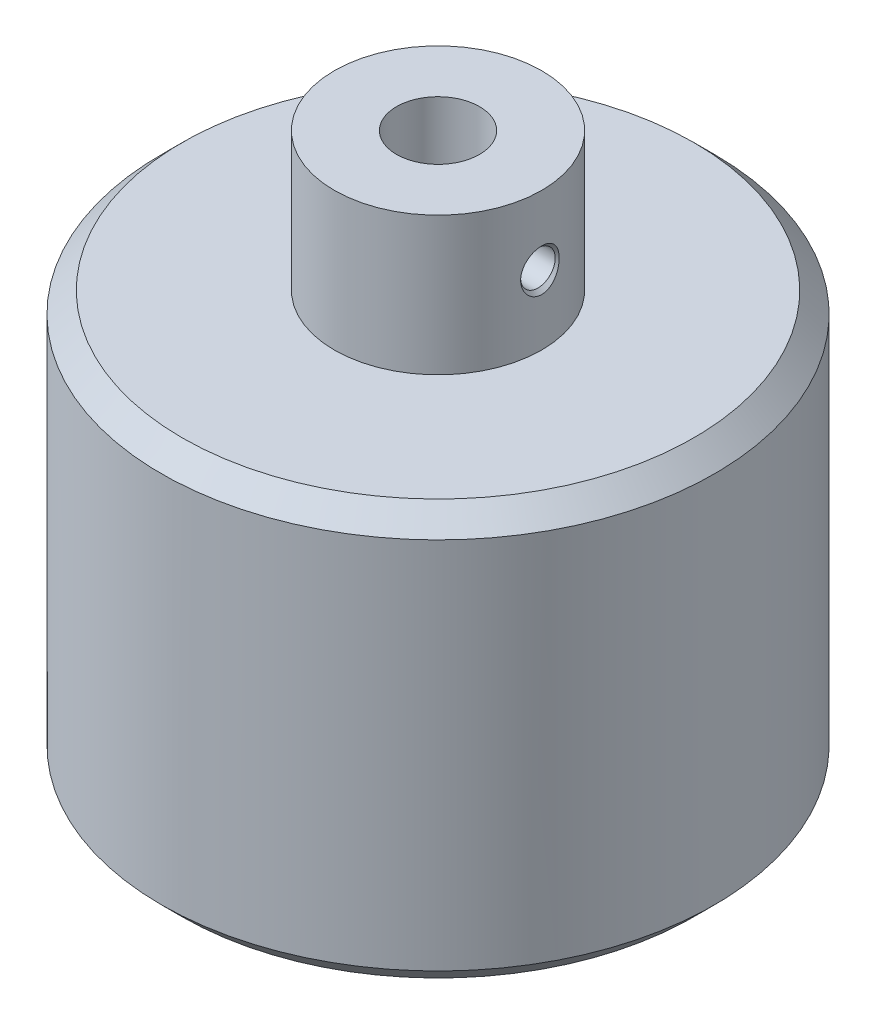
ISO-10303-21;
HEADER;
FILE_DESCRIPTION(('STEP AP214'),'2;1');
FILE_NAME('part.step','',(''),(''),'','','');
FILE_SCHEMA(('AUTOMOTIVE_DESIGN { 1 0 10303 214 1 1 1 1 }'));
ENDSEC;
DATA;
#1=APPLICATION_CONTEXT('core data for automotive mechanical design processes');
#2=APPLICATION_PROTOCOL_DEFINITION('international standard','automotive_design',2000,#1);
#3=PRODUCT_CONTEXT('',#1,'mechanical');
#4=PRODUCT('Part','Part','',(#3));
#5=PRODUCT_RELATED_PRODUCT_CATEGORY('part','',(#4));
#6=PRODUCT_DEFINITION_FORMATION('','',#4);
#7=PRODUCT_DEFINITION_CONTEXT('part definition',#1,'design');
#8=PRODUCT_DEFINITION('design','',#6,#7);
#9=PRODUCT_DEFINITION_SHAPE('','',#8);
#10=(LENGTH_UNIT() NAMED_UNIT(*) SI_UNIT(.MILLI.,.METRE.));
#11=(NAMED_UNIT(*) PLANE_ANGLE_UNIT() SI_UNIT($,.RADIAN.));
#12=(NAMED_UNIT(*) SI_UNIT($,.STERADIAN.) SOLID_ANGLE_UNIT());
#13=UNCERTAINTY_MEASURE_WITH_UNIT(LENGTH_MEASURE(1.E-05),#10,'distance_accuracy_value','');
#14=(GEOMETRIC_REPRESENTATION_CONTEXT(3) GLOBAL_UNCERTAINTY_ASSIGNED_CONTEXT((#13)) GLOBAL_UNIT_ASSIGNED_CONTEXT((#10,
#11,#12)) REPRESENTATION_CONTEXT('',''));
#15=CARTESIAN_POINT('',(0.,0.,0.));
#16=DIRECTION('',(0.,0.,1.));
#17=DIRECTION('',(1.,0.,0.));
#18=AXIS2_PLACEMENT_3D('',#15,#16,#17);
#19=CARTESIAN_POINT('',(0.,30.,0.));
#20=DIRECTION('',(0.,-1.,0.));
#21=DIRECTION('',(0.,0.,-1.));
#22=AXIS2_PLACEMENT_3D('',#19,#20,#21);
#23=CYLINDRICAL_SURFACE('',#22,20.);
#24=CARTESIAN_POINT('',(0.,1.49999999999999,0.));
#25=DIRECTION('',(0.,1.,0.));
#26=DIRECTION('',(0.,0.,1.));
#27=AXIS2_PLACEMENT_3D('',#24,#25,#26);
#28=CIRCLE('',#27,20.);
#29=CARTESIAN_POINT('',(0.,1.49999999999999,20.));
#30=VERTEX_POINT('',#29);
#31=EDGE_CURVE('E43',#30,#30,#28,.T.);
#32=ORIENTED_EDGE('',*,*,#31,.T.);
#33=EDGE_LOOP('',(#32));
#34=FACE_BOUND('',#33,.T.);
#35=CARTESIAN_POINT('',(0.,28.5,0.));
#36=DIRECTION('',(0.,1.,0.));
#37=DIRECTION('',(0.,0.,1.));
#38=AXIS2_PLACEMENT_3D('',#35,#36,#37);
#39=CIRCLE('',#38,20.);
#40=CARTESIAN_POINT('',(0.,28.5,-20.));
#41=VERTEX_POINT('',#40);
#42=EDGE_CURVE('E47',#41,#41,#39,.F.);
#43=ORIENTED_EDGE('',*,*,#42,.T.);
#44=EDGE_LOOP('',(#43));
#45=FACE_BOUND('',#44,.T.);
#46=ADVANCED_FACE('F32',(#34,#45),#23,.T.);
#47=CARTESIAN_POINT('',(0.,30.,0.));
#48=DIRECTION('',(0.,1.,0.));
#49=DIRECTION('',(0.,0.,1.));
#50=AXIS2_PLACEMENT_3D('',#47,#48,#49);
#51=PLANE('',#50);
#52=CARTESIAN_POINT('',(0.,30.,0.));
#53=DIRECTION('',(0.,1.,0.));
#54=DIRECTION('',(0.,0.,1.));
#55=AXIS2_PLACEMENT_3D('',#52,#53,#54);
#56=CIRCLE('',#55,18.5);
#57=CARTESIAN_POINT('',(0.,30.,-18.5));
#58=VERTEX_POINT('',#57);
#59=EDGE_CURVE('E10',#58,#58,#56,.T.);
#60=ORIENTED_EDGE('',*,*,#59,.T.);
#61=EDGE_LOOP('',(#60));
#62=FACE_BOUND('',#61,.T.);
#63=CARTESIAN_POINT('',(0.,30.,0.));
#64=DIRECTION('',(0.,1.,0.));
#65=DIRECTION('',(0.,0.,1.));
#66=AXIS2_PLACEMENT_3D('',#63,#64,#65);
#67=CIRCLE('',#66,7.5);
#68=CARTESIAN_POINT('',(0.,30.,7.5));
#69=VERTEX_POINT('',#68);
#70=EDGE_CURVE('E59',#69,#69,#67,.F.);
#71=ORIENTED_EDGE('',*,*,#70,.T.);
#72=EDGE_LOOP('',(#71));
#73=FACE_BOUND('',#72,.T.);
#74=ADVANCED_FACE('F99',(#62,#73),#51,.T.);
#75=CARTESIAN_POINT('',(0.,0.,0.));
#76=DIRECTION('',(0.,1.,0.));
#77=DIRECTION('',(0.,0.,1.));
#78=AXIS2_PLACEMENT_3D('',#75,#76,#77);
#79=PLANE('',#78);
#80=CARTESIAN_POINT('',(0.,0.,0.));
#81=DIRECTION('',(0.,1.,0.));
#82=DIRECTION('',(0.,0.,1.));
#83=AXIS2_PLACEMENT_3D('',#80,#81,#82);
#84=CIRCLE('',#83,18.5);
#85=CARTESIAN_POINT('',(0.,0.,18.5));
#86=VERTEX_POINT('',#85);
#87=EDGE_CURVE('E39',#86,#86,#84,.F.);
#88=ORIENTED_EDGE('',*,*,#87,.T.);
#89=EDGE_LOOP('',(#88));
#90=FACE_BOUND('',#89,.T.);
#91=CARTESIAN_POINT('',(0.,0.,0.));
#92=DIRECTION('',(0.,1.,0.));
#93=DIRECTION('',(0.,0.,1.));
#94=AXIS2_PLACEMENT_3D('',#91,#92,#93);
#95=CIRCLE('',#94,3.);
#96=CARTESIAN_POINT('',(0.,0.,3.));
#97=VERTEX_POINT('',#96);
#98=EDGE_CURVE('E88',#97,#97,#95,.T.);
#99=ORIENTED_EDGE('',*,*,#98,.T.);
#100=EDGE_LOOP('',(#99));
#101=FACE_BOUND('',#100,.T.);
#102=ADVANCED_FACE('F104',(#90,#101),#79,.F.);
#103=CARTESIAN_POINT('',(0.,40.,0.));
#104=DIRECTION('',(0.,-1.,0.));
#105=DIRECTION('',(0.,0.,-1.));
#106=AXIS2_PLACEMENT_3D('',#103,#104,#105);
#107=CYLINDRICAL_SURFACE('',#106,7.5);
#108=CARTESIAN_POINT('',(7.43001548003896,33.9645290952906,-1.02218884462689));
#109=CARTESIAN_POINT('',(7.43639922008393,33.9097481715944,-0.975784360702175));
#110=CARTESIAN_POINT('',(7.44288567725482,33.8583353599831,-0.925421675809617));
#111=CARTESIAN_POINT('',(7.45551003217192,33.7635914759309,-0.8175084104551));
#112=CARTESIAN_POINT('',(7.46164784673965,33.7202623264885,-0.759956125102899));
#113=CARTESIAN_POINT('',(7.47372710362342,33.6381636485537,-0.630954394262095));
#114=CARTESIAN_POINT('',(7.47954428253293,33.6006749497841,-0.558668406622472));
#115=CARTESIAN_POINT('',(7.48925514164225,33.5395862251771,-0.408308231881432));
#116=CARTESIAN_POINT('',(7.49314938643558,33.5159821222877,-0.330235751506737));
#117=CARTESIAN_POINT('',(7.49824221982515,33.4853702900279,-0.177922897353143));
#118=CARTESIAN_POINT('',(7.49964659618561,33.4770927483593,-0.103943655998851));
#119=CARTESIAN_POINT('',(7.50023488295556,33.4736087383806,0.0443146590618781));
#120=CARTESIAN_POINT('',(7.49941966453717,33.4783971417995,0.118593603710441));
#121=CARTESIAN_POINT('',(7.49576445751884,33.5002299731908,0.261492180615364));
#122=CARTESIAN_POINT('',(7.49302640931871,33.5166577075203,0.33021017342384));
#123=CARTESIAN_POINT('',(7.48593295224222,33.5603612170139,0.464004184734205));
#124=CARTESIAN_POINT('',(7.48157737978603,33.5876380893686,0.529079834120613));
#125=CARTESIAN_POINT('',(7.47153687862633,33.6529558331763,0.655984695435617));
#126=CARTESIAN_POINT('',(7.46581550653599,33.6912992027681,0.717654694801995));
#127=CARTESIAN_POINT('',(7.45368553273536,33.7770120959233,0.834275955871314));
#128=CARTESIAN_POINT('',(7.44727671181421,33.8243845023923,0.88922506241738));
#129=CARTESIAN_POINT('',(7.43381213224409,33.9310434327827,0.995772079421973));
#130=CARTESIAN_POINT('',(7.42674722815583,33.9909962679959,1.04670145142327));
#131=CARTESIAN_POINT('',(7.41319414196055,34.1180724823424,1.13873675079608));
#132=CARTESIAN_POINT('',(7.40670618101186,34.1851985896669,1.17983892123625));
#133=CARTESIAN_POINT('',(7.39440209830874,34.3310024956612,1.25474623493326));
#134=CARTESIAN_POINT('',(7.38869374004265,34.4101771984203,1.28760378092002));
#135=CARTESIAN_POINT('',(7.37928759679343,34.5728215336854,1.34046152232599));
#136=CARTESIAN_POINT('',(7.37559034916398,34.6562923075546,1.36045828169948));
#137=CARTESIAN_POINT('',(7.37046355239542,34.8298578249214,1.38797681918808));
#138=CARTESIAN_POINT('',(7.36916356021645,34.9200700077415,1.39478683120812));
#139=CARTESIAN_POINT('',(7.36937366227069,35.1004066362285,1.39367520889355));
#140=CARTESIAN_POINT('',(7.37088415347988,35.1905310677016,1.38575149344512));
#141=CARTESIAN_POINT('',(7.3765851928294,35.3695480825654,1.35507829206451));
#142=CARTESIAN_POINT('',(7.38081583760976,35.4584015575074,1.33210689767788));
#143=CARTESIAN_POINT('',(7.39149151307905,35.6308565581466,1.27153200574317));
#144=CARTESIAN_POINT('',(7.39793671981201,35.7144576656878,1.23392734490905));
#145=CARTESIAN_POINT('',(7.41214841705282,35.8725867100132,1.14543787911347));
#146=CARTESIAN_POINT('',(7.41989409194696,35.9472299570333,1.0947564182379));
#147=CARTESIAN_POINT('',(7.43580697153918,36.0862283665429,0.980850943409379));
#148=CARTESIAN_POINT('',(7.44397406178901,36.1505863030718,0.917630321723148));
#149=CARTESIAN_POINT('',(7.4591809573134,36.2629512801142,0.784129806114616));
#150=CARTESIAN_POINT('',(7.46625867450482,36.3116903444969,0.714472302826206));
#151=CARTESIAN_POINT('',(7.47888585855502,36.3953811103906,0.567188702616259));
#152=CARTESIAN_POINT('',(7.48443656601968,36.4303440142677,0.489569145210668));
#153=CARTESIAN_POINT('',(7.49279457332355,36.4819724132014,0.336630906505777));
#154=CARTESIAN_POINT('',(7.49581423219888,36.5000732580089,0.261807789756014));
#155=CARTESIAN_POINT('',(7.49957505778735,36.5225242802148,0.110079367534782));
#156=CARTESIAN_POINT('',(7.50031742711152,36.5268817153877,0.0331751827069539));
#157=CARTESIAN_POINT('',(7.49946312322404,36.5218194753594,-0.114496578108778));
#158=CARTESIAN_POINT('',(7.49803372275698,36.5133851286439,-0.185301207844606));
#159=CARTESIAN_POINT('',(7.49330175238252,36.4849245284627,-0.324464103373541));
#160=CARTESIAN_POINT('',(7.4899992262175,36.4648985456918,-0.392822426254668));
#161=CARTESIAN_POINT('',(7.48186217326874,36.4140387679977,-0.52552735843261));
#162=CARTESIAN_POINT('',(7.47702266068911,36.3831697646024,-0.589860084620356));
#163=CARTESIAN_POINT('',(7.46630242718634,36.3118181316151,-0.712842998432213));
#164=CARTESIAN_POINT('',(7.46042144041114,36.2713330464701,-0.771491729201932));
#165=CARTESIAN_POINT('',(7.44772943136413,36.1788971148575,-0.885932073753493));
#166=CARTESIAN_POINT('',(7.44088203743954,36.1263371691847,-0.941226911300894));
#167=CARTESIAN_POINT('',(7.42728891193738,36.0133424957455,-1.04308471371259));
#168=CARTESIAN_POINT('',(7.42054322066765,35.9529047327805,-1.08964429606746));
#169=CARTESIAN_POINT('',(7.40718607879,35.8199216963037,-1.17717283127671));
#170=CARTESIAN_POINT('',(7.40064355188102,35.7467744610288,-1.21723874192614));
#171=CARTESIAN_POINT('',(7.38909339084178,35.5950246068513,-1.28549599594284));
#172=CARTESIAN_POINT('',(7.38408622489728,35.5164203328484,-1.31368371820988));
#173=CARTESIAN_POINT('',(7.37584528575633,35.3503669394214,-1.35922200044936));
#174=CARTESIAN_POINT('',(7.37275194059692,35.2626774810087,-1.37572511639109));
#175=CARTESIAN_POINT('',(7.36923537742758,35.08572353141,-1.39443912424063));
#176=CARTESIAN_POINT('',(7.36881281380088,34.9964586595953,-1.3966465134752));
#177=CARTESIAN_POINT('',(7.37071163034799,34.8163703546904,-1.38659247563587));
#178=CARTESIAN_POINT('',(7.37310674923995,34.7255691463853,-1.37394223917393));
#179=CARTESIAN_POINT('',(7.38048297879077,34.5474334549448,-1.33374868606027));
#180=CARTESIAN_POINT('',(7.38546357822963,34.4600982901515,-1.30620831354976));
#181=CARTESIAN_POINT('',(7.39671630188251,34.3012836110106,-1.24078544789289));
#182=CARTESIAN_POINT('',(7.40277196694046,34.2291393468262,-1.20447064840481));
#183=CARTESIAN_POINT('',(7.41584777174045,34.0914351061866,-1.12114949413117));
#184=CARTESIAN_POINT('',(7.42286722942637,34.025870529718,-1.07415068491252));
#185=CARTESIAN_POINT('',(7.43001548003896,33.9645290952906,-1.02218884462689));
#186=B_SPLINE_CURVE_WITH_KNOTS('',3,(#108,#109,#110,#111,#112,#113,#114,#115,#116,#117,#118,
#119,#120,#121,#122,#123,#124,#125,#126,#127,#128,#129,#130,#131,#132,#133,#134,#135,#136,#137,
#138,#139,#140,#141,#142,#143,#144,#145,#146,#147,#148,#149,#150,#151,#152,#153,#154,#155,#156,
#157,#158,#159,#160,#161,#162,#163,#164,#165,#166,#167,#168,#169,#170,#171,#172,#173,#174,#175,
#176,#177,#178,#179,#180,#181,#182,#183,#184,#185),.UNSPECIFIED.,.T.,.F.,(4,2,2,2,2,2,2,2,2,2,2,
2,2,2,2,2,2,2,2,2,2,2,2,2,2,2,2,2,2,2,2,2,2,2,2,2,2,2,4),(0.,0.216019342441091,0.4320900077435,
0.675641911290071,0.919122262875252,1.14133033231608,1.36345119954822,1.5746069634577,
1.78578408731507,2.0033921473424,2.22106980478516,2.45702056842509,2.69306139213585,
2.94966477214477,3.20633668101575,3.47651403663212,3.74672955723728,4.02102247947896,
4.29533721136495,4.56561951714876,4.83582880192688,5.09036071687425,5.34468522472085,
5.57457225508551,5.80433786377281,6.01728126905524,6.23021970175818,6.44385605985824,
6.65754703068501,6.88637703362007,7.11529546319704,7.365187353059,7.61515536817453,
7.88178257020165,8.14847509752937,8.422305105934,8.69608099129128,8.93814102875581,
9.18003063987057),.UNSPECIFIED.);
#187=CARTESIAN_POINT('',(7.43001548003896,33.9645290952906,-1.02218884462689));
#188=VERTEX_POINT('',#187);
#189=EDGE_CURVE('E52',#188,#188,#186,.T.);
#190=ORIENTED_EDGE('',*,*,#189,.T.);
#191=EDGE_LOOP('',(#190));
#192=FACE_BOUND('',#191,.T.);
#193=ORIENTED_EDGE('',*,*,#70,.F.);
#194=EDGE_LOOP('',(#193));
#195=FACE_BOUND('',#194,.T.);
#196=CARTESIAN_POINT('',(0.,40.,0.));
#197=DIRECTION('',(0.,1.,0.));
#198=DIRECTION('',(0.,0.,1.));
#199=AXIS2_PLACEMENT_3D('',#196,#197,#198);
#200=CIRCLE('',#199,7.5);
#201=CARTESIAN_POINT('',(0.,40.,7.5));
#202=VERTEX_POINT('',#201);
#203=EDGE_CURVE('E91',#202,#202,#200,.T.);
#204=ORIENTED_EDGE('',*,*,#203,.F.);
#205=EDGE_LOOP('',(#204));
#206=FACE_BOUND('',#205,.T.);
#207=ADVANCED_FACE('F61',(#192,#195,#206),#107,.T.);
#208=CARTESIAN_POINT('',(0.,40.,0.));
#209=DIRECTION('',(0.,1.,0.));
#210=DIRECTION('',(0.,0.,1.));
#211=AXIS2_PLACEMENT_3D('',#208,#209,#210);
#212=PLANE('',#211);
#213=CARTESIAN_POINT('',(0.,40.,0.));
#214=DIRECTION('',(0.,1.,0.));
#215=DIRECTION('',(0.,0.,1.));
#216=AXIS2_PLACEMENT_3D('',#213,#214,#215);
#217=CIRCLE('',#216,3.);
#218=CARTESIAN_POINT('',(0.,40.,3.));
#219=VERTEX_POINT('',#218);
#220=EDGE_CURVE('E86',#219,#219,#217,.T.);
#221=ORIENTED_EDGE('',*,*,#220,.F.);
#222=EDGE_LOOP('',(#221));
#223=FACE_BOUND('',#222,.T.);
#224=ORIENTED_EDGE('',*,*,#203,.T.);
#225=EDGE_LOOP('',(#224));
#226=FACE_BOUND('',#225,.T.);
#227=ADVANCED_FACE('F103',(#223,#226),#212,.T.);
#228=CARTESIAN_POINT('',(0.,0.,0.));
#229=DIRECTION('',(0.,1.,0.));
#230=DIRECTION('',(0.,0.,1.));
#231=AXIS2_PLACEMENT_3D('',#228,#229,#230);
#232=CYLINDRICAL_SURFACE('',#231,3.);
#233=CARTESIAN_POINT('',(2.72717802865893,35.,-1.25));
#234=CARTESIAN_POINT('',(2.72718519563219,35.0666718908969,-1.24999259066568));
#235=CARTESIAN_POINT('',(2.729658595344,35.1334526568262,-1.24463203881503));
#236=CARTESIAN_POINT('',(2.73923833650884,35.2650869420571,-1.22339678947785));
#237=CARTESIAN_POINT('',(2.74635725824267,35.3299347266752,-1.20749354003277));
#238=CARTESIAN_POINT('',(2.76426917574768,35.4555611296911,-1.16589988419451));
#239=CARTESIAN_POINT('',(2.77504717562616,35.516355163715,-1.14024937431428));
#240=CARTESIAN_POINT('',(2.79904148565793,35.6327594495781,-1.08000637754463));
#241=CARTESIAN_POINT('',(2.81225721880783,35.6883709234331,-1.04541600591531));
#242=CARTESIAN_POINT('',(2.84055762619857,35.7963257249735,-0.965973882676168));
#243=CARTESIAN_POINT('',(2.85570568079146,35.8483075587441,-0.92065323818441));
#244=CARTESIAN_POINT('',(2.88564295372227,35.9442002224976,-0.822021675745551));
#245=CARTESIAN_POINT('',(2.90043203180789,35.988107940613,-0.768707691374007));
#246=CARTESIAN_POINT('',(2.92875537930613,36.0684495308793,-0.652763393797352));
#247=CARTESIAN_POINT('',(2.94220739975291,36.1044766280324,-0.589829293683664));
#248=CARTESIAN_POINT('',(2.96556519993426,36.1652760205056,-0.458132022362359));
#249=CARTESIAN_POINT('',(2.97547255347157,36.1900533119642,-0.38937145487213));
#250=CARTESIAN_POINT('',(2.99017521042367,36.2263394587567,-0.251768498025171));
#251=CARTESIAN_POINT('',(2.99520971127466,36.238471694902,-0.183116576196086));
#252=CARTESIAN_POINT('',(3.00046828611204,36.2511376411599,-0.04457918036501));
#253=CARTESIAN_POINT('',(3.00069431131015,36.251676055883,0.0253057817645132));
#254=CARTESIAN_POINT('',(2.99645129133057,36.2414657190667,0.159792780112566));
#255=CARTESIAN_POINT('',(2.99226714648664,36.2314018994743,0.224457488607312));
#256=CARTESIAN_POINT('',(2.98006516750309,36.2014468973618,0.351082893931455));
#257=CARTESIAN_POINT('',(2.97204705074577,36.1815549903698,0.413043391054915));
#258=CARTESIAN_POINT('',(2.95279852414029,36.1322719591054,0.533638118077524));
#259=CARTESIAN_POINT('',(2.94152097126085,36.1027405371292,0.592207177074904));
#260=CARTESIAN_POINT('',(2.91685713989805,36.0351542432997,0.703711767281961));
#261=CARTESIAN_POINT('',(2.90347011666255,35.997096359155,0.756645297756972));
#262=CARTESIAN_POINT('',(2.87481698777061,35.9104175795954,0.859340911707922));
#263=CARTESIAN_POINT('',(2.8594849435601,35.861241208721,0.908616437316238));
#264=CARTESIAN_POINT('',(2.8293786068147,35.7552885592934,0.998431414927666));
#265=CARTESIAN_POINT('',(2.8146045313137,35.6985093617079,1.03896749582431));
#266=CARTESIAN_POINT('',(2.78681612355338,35.5766049633381,1.11140189250063));
#267=CARTESIAN_POINT('',(2.77387558556714,35.5112667942567,1.1429725335554));
#268=CARTESIAN_POINT('',(2.75209844221011,35.3755189550255,1.19446432058392));
#269=CARTESIAN_POINT('',(2.74325890334594,35.3051129517305,1.21439379627313));
#270=CARTESIAN_POINT('',(2.73141212519723,35.166103191086,1.24080025168121));
#271=CARTESIAN_POINT('',(2.72806369197117,35.097678877741,1.24806614632866));
#272=CARTESIAN_POINT('',(2.72660286810642,34.9605215175885,1.25125630518999));
#273=CARTESIAN_POINT('',(2.72848866599319,34.8917885858083,1.24718449318149));
#274=CARTESIAN_POINT('',(2.73693131345749,34.7606016145696,1.22853477565556));
#275=CARTESIAN_POINT('',(2.74318138016618,34.6980273132132,1.21464618818049));
#276=CARTESIAN_POINT('',(2.75925630297447,34.5761487035021,1.17767058564226));
#277=CARTESIAN_POINT('',(2.76908199460161,34.5168451631693,1.15458142053125));
#278=CARTESIAN_POINT('',(2.79170797857,34.4003846896435,1.09877520805187));
#279=CARTESIAN_POINT('',(2.80461662202282,34.3434250253897,1.06569183306198));
#280=CARTESIAN_POINT('',(2.83180003740794,34.235591947501,0.991200784385975));
#281=CARTESIAN_POINT('',(2.84607539920583,34.1847211832981,0.949789507875994));
#282=CARTESIAN_POINT('',(2.87578619784532,34.086199865116,0.855844455715511));
#283=CARTESIAN_POINT('',(2.89122146708841,34.0391486000494,0.802679661479743));
#284=CARTESIAN_POINT('',(2.92043361183923,33.9545277080207,0.688851512553541));
#285=CARTESIAN_POINT('',(2.93421036577013,33.9169587759363,0.628187608803658));
#286=CARTESIAN_POINT('',(2.9586425158565,33.8524101245564,0.500654680803386));
#287=CARTESIAN_POINT('',(2.96928983138826,33.8254577587105,0.433770169638509));
#288=CARTESIAN_POINT('',(2.98618173103366,33.7833832076656,0.295858835154421));
#289=CARTESIAN_POINT('',(2.9924289351992,33.7682539817739,0.2248345042252));
#290=CARTESIAN_POINT('',(2.9995153479751,33.7511418744797,0.0860165335064167));
#291=CARTESIAN_POINT('',(3.00070204534225,33.748314000303,0.0183440847939032));
#292=CARTESIAN_POINT('',(2.99849523480953,33.7536131412939,-0.116486811714281));
#293=CARTESIAN_POINT('',(2.99510252984313,33.7617382360129,-0.183645347541151));
#294=CARTESIAN_POINT('',(2.98430065981734,33.7881060721587,-0.313086482449181));
#295=CARTESIAN_POINT('',(2.97703824209233,33.8059796804695,-0.375457537843565));
#296=CARTESIAN_POINT('',(2.95929499847058,33.8509342472091,-0.496292230501328));
#297=CARTESIAN_POINT('',(2.94881356124207,33.8780169546649,-0.554755122985825));
#298=CARTESIAN_POINT('',(2.92505825398662,33.9419895292145,-0.669024565478782));
#299=CARTESIAN_POINT('',(2.91167959188766,33.979267301424,-0.724591657976684));
#300=CARTESIAN_POINT('',(2.88371561874231,34.0620071828719,-0.828918675638783));
#301=CARTESIAN_POINT('',(2.86912986083797,34.1074723304068,-0.877676061786042));
#302=CARTESIAN_POINT('',(2.83914845259141,34.2089448258544,-0.97044978723158));
#303=CARTESIAN_POINT('',(2.82376522857896,34.2654590146211,-1.01391775364847));
#304=CARTESIAN_POINT('',(2.79495552690186,34.3854587406802,-1.09083332306675));
#305=CARTESIAN_POINT('',(2.78153014522558,34.4489481480581,-1.12427532456755));
#306=CARTESIAN_POINT('',(2.75842557732642,34.5809438350228,-1.17982766043577));
#307=CARTESIAN_POINT('',(2.74872654469865,34.6494211587932,-1.20199823632854));
#308=CARTESIAN_POINT('',(2.73440803066667,34.7895395738507,-1.23423556453801));
#309=CARTESIAN_POINT('',(2.7297715160498,34.8611692072743,-1.2443429152121));
#310=CARTESIAN_POINT('',(2.72744979732688,34.9553585242619,-1.2494046492365));
#311=CARTESIAN_POINT('',(2.72717562860874,34.977673157388,-1.25000248121118));
#312=CARTESIAN_POINT('',(2.72717802865893,35.,-1.25));
#313=B_SPLINE_CURVE_WITH_KNOTS('',3,(#233,#234,#235,#236,#237,#238,#239,#240,#241,#242,#243,
#244,#245,#246,#247,#248,#249,#250,#251,#252,#253,#254,#255,#256,#257,#258,#259,#260,#261,#262,
#263,#264,#265,#266,#267,#268,#269,#270,#271,#272,#273,#274,#275,#276,#277,#278,#279,#280,#281,
#282,#283,#284,#285,#286,#287,#288,#289,#290,#291,#292,#293,#294,#295,#296,#297,#298,#299,#300,
#301,#302,#303,#304,#305,#306,#307,#308,#309,#310,#311,#312),.UNSPECIFIED.,.T.,.F.,(4,2,2,2,2,2,
2,2,2,2,2,2,2,2,2,2,2,2,2,2,2,2,2,2,2,2,2,2,2,2,2,2,2,2,2,2,2,2,2,4),(0.,0.199951711985522,
0.400447161842174,0.60013065215211,0.799766938550101,1.01066841430654,1.2216510045991,
1.44178476577924,1.66182066774891,1.87040605977952,2.0789068091793,2.27471840245093,
2.47054443201884,2.66935814640066,2.86824221022484,3.08114531844484,3.29413040441367,
3.51411545666722,3.73394290745569,3.93950778306308,4.14500152518449,4.33733901066192,
4.5297214691353,4.73025126818169,4.93086800795465,5.14781662735514,5.36478114041867,
5.58230105955595,5.79969134643008,6.00188635094054,6.20404590801915,6.39903415036488,
6.59405944632173,6.79789862829038,7.00181361048905,7.21960426908078,7.4375163813919,
7.65425125796866,7.87025464546164,7.93721375436707),.UNSPECIFIED.);
#314=CARTESIAN_POINT('',(2.72717802865893,35.,-1.25));
#315=VERTEX_POINT('',#314);
#316=EDGE_CURVE('E80',#315,#315,#313,.T.);
#317=ORIENTED_EDGE('',*,*,#316,.T.);
#318=EDGE_LOOP('',(#317));
#319=FACE_BOUND('',#318,.T.);
#320=ORIENTED_EDGE('',*,*,#98,.F.);
#321=EDGE_LOOP('',(#320));
#322=FACE_BOUND('',#321,.T.);
#323=ORIENTED_EDGE('',*,*,#220,.T.);
#324=EDGE_LOOP('',(#323));
#325=FACE_BOUND('',#324,.T.);
#326=ADVANCED_FACE('F70',(#319,#322,#325),#232,.F.);
#327=CARTESIAN_POINT('',(7.5,35.,0.));
#328=DIRECTION('',(1.,0.,0.));
#329=DIRECTION('',(0.,0.,-1.));
#330=AXIS2_PLACEMENT_3D('',#327,#328,#329);
#331=CONICAL_SURFACE('',#330,1.525,0.785398163397444);
#332=CARTESIAN_POINT('',(7.225,35.,0.));
#333=DIRECTION('',(1.,0.,0.));
#334=DIRECTION('',(0.,0.,-1.));
#335=AXIS2_PLACEMENT_3D('',#332,#333,#334);
#336=CIRCLE('',#335,1.25);
#337=CARTESIAN_POINT('',(7.225,35.,-1.25));
#338=VERTEX_POINT('',#337);
#339=EDGE_CURVE('E87',#338,#338,#336,.T.);
#340=ORIENTED_EDGE('',*,*,#339,.F.);
#341=EDGE_LOOP('',(#340));
#342=FACE_BOUND('',#341,.T.);
#343=ORIENTED_EDGE('',*,*,#189,.F.);
#344=EDGE_LOOP('',(#343));
#345=FACE_BOUND('',#344,.T.);
#346=ADVANCED_FACE('F65',(#342,#345),#331,.F.);
#347=CARTESIAN_POINT('',(7.5,35.,0.));
#348=DIRECTION('',(1.,0.,0.));
#349=DIRECTION('',(0.,0.,-1.));
#350=AXIS2_PLACEMENT_3D('',#347,#348,#349);
#351=CYLINDRICAL_SURFACE('',#350,1.25);
#352=ORIENTED_EDGE('',*,*,#316,.F.);
#353=EDGE_LOOP('',(#352));
#354=FACE_BOUND('',#353,.T.);
#355=ORIENTED_EDGE('',*,*,#339,.T.);
#356=EDGE_LOOP('',(#355));
#357=FACE_BOUND('',#356,.T.);
#358=ADVANCED_FACE('F69',(#354,#357),#351,.F.);
#359=CARTESIAN_POINT('',(0.,1.49999999999999,0.));
#360=DIRECTION('',(0.,1.,0.));
#361=DIRECTION('',(0.,0.,1.));
#362=AXIS2_PLACEMENT_3D('',#359,#360,#361);
#363=CONICAL_SURFACE('',#362,20.,0.785398163397452);
#364=ORIENTED_EDGE('',*,*,#87,.F.);
#365=EDGE_LOOP('',(#364));
#366=FACE_BOUND('',#365,.T.);
#367=ORIENTED_EDGE('',*,*,#31,.F.);
#368=EDGE_LOOP('',(#367));
#369=FACE_BOUND('',#368,.T.);
#370=ADVANCED_FACE('F75',(#366,#369),#363,.T.);
#371=CARTESIAN_POINT('',(0.,30.,0.));
#372=DIRECTION('',(0.,-1.,0.));
#373=DIRECTION('',(0.,0.,-1.));
#374=AXIS2_PLACEMENT_3D('',#371,#372,#373);
#375=CONICAL_SURFACE('',#374,18.5,0.785398163397446);
#376=CARTESIAN_POINT('',(0.,28.5,-20.));
#377=CARTESIAN_POINT('',(0.,28.515625,-19.984375));
#378=CARTESIAN_POINT('',(0.,28.53125,-19.96875));
#379=CARTESIAN_POINT('',(0.,28.5625,-19.9375));
#380=CARTESIAN_POINT('',(0.,28.578125,-19.921875));
#381=CARTESIAN_POINT('',(0.,28.609375,-19.890625));
#382=CARTESIAN_POINT('',(0.,28.625,-19.875));
#383=CARTESIAN_POINT('',(0.,28.65625,-19.84375));
#384=CARTESIAN_POINT('',(0.,28.671875,-19.828125));
#385=CARTESIAN_POINT('',(0.,28.703125,-19.796875));
#386=CARTESIAN_POINT('',(0.,28.71875,-19.78125));
#387=CARTESIAN_POINT('',(0.,28.75,-19.75));
#388=CARTESIAN_POINT('',(0.,28.765625,-19.734375));
#389=CARTESIAN_POINT('',(0.,28.796875,-19.703125));
#390=CARTESIAN_POINT('',(0.,28.8125,-19.6875));
#391=CARTESIAN_POINT('',(0.,28.84375,-19.65625));
#392=CARTESIAN_POINT('',(0.,28.859375,-19.640625));
#393=CARTESIAN_POINT('',(0.,28.890625,-19.609375));
#394=CARTESIAN_POINT('',(0.,28.90625,-19.59375));
#395=CARTESIAN_POINT('',(0.,28.9375,-19.5625));
#396=CARTESIAN_POINT('',(0.,28.953125,-19.546875));
#397=CARTESIAN_POINT('',(0.,28.984375,-19.515625));
#398=CARTESIAN_POINT('',(0.,29.,-19.5));
#399=CARTESIAN_POINT('',(0.,29.03125,-19.46875));
#400=CARTESIAN_POINT('',(0.,29.046875,-19.453125));
#401=CARTESIAN_POINT('',(0.,29.078125,-19.421875));
#402=CARTESIAN_POINT('',(0.,29.09375,-19.40625));
#403=CARTESIAN_POINT('',(0.,29.125,-19.375));
#404=CARTESIAN_POINT('',(0.,29.140625,-19.359375));
#405=CARTESIAN_POINT('',(0.,29.171875,-19.328125));
#406=CARTESIAN_POINT('',(0.,29.1875,-19.3125));
#407=CARTESIAN_POINT('',(0.,29.21875,-19.28125));
#408=CARTESIAN_POINT('',(0.,29.234375,-19.265625));
#409=CARTESIAN_POINT('',(0.,29.265625,-19.234375));
#410=CARTESIAN_POINT('',(0.,29.28125,-19.21875));
#411=CARTESIAN_POINT('',(0.,29.3125,-19.1875));
#412=CARTESIAN_POINT('',(0.,29.328125,-19.171875));
#413=CARTESIAN_POINT('',(0.,29.359375,-19.140625));
#414=CARTESIAN_POINT('',(0.,29.375,-19.125));
#415=CARTESIAN_POINT('',(0.,29.40625,-19.09375));
#416=CARTESIAN_POINT('',(0.,29.421875,-19.078125));
#417=CARTESIAN_POINT('',(0.,29.453125,-19.046875));
#418=CARTESIAN_POINT('',(0.,29.46875,-19.03125));
#419=CARTESIAN_POINT('',(0.,29.5,-19.));
#420=CARTESIAN_POINT('',(0.,29.515625,-18.984375));
#421=CARTESIAN_POINT('',(0.,29.546875,-18.953125));
#422=CARTESIAN_POINT('',(0.,29.5625,-18.9375));
#423=CARTESIAN_POINT('',(0.,29.59375,-18.90625));
#424=CARTESIAN_POINT('',(0.,29.609375,-18.890625));
#425=CARTESIAN_POINT('',(0.,29.640625,-18.859375));
#426=CARTESIAN_POINT('',(0.,29.65625,-18.84375));
#427=CARTESIAN_POINT('',(0.,29.6875,-18.8125));
#428=CARTESIAN_POINT('',(0.,29.703125,-18.796875));
#429=CARTESIAN_POINT('',(0.,29.734375,-18.765625));
#430=CARTESIAN_POINT('',(0.,29.75,-18.75));
#431=CARTESIAN_POINT('',(0.,29.78125,-18.71875));
#432=CARTESIAN_POINT('',(0.,29.796875,-18.703125));
#433=CARTESIAN_POINT('',(0.,29.828125,-18.671875));
#434=CARTESIAN_POINT('',(0.,29.84375,-18.65625));
#435=CARTESIAN_POINT('',(0.,29.875,-18.625));
#436=CARTESIAN_POINT('',(0.,29.890625,-18.609375));
#437=CARTESIAN_POINT('',(0.,29.921875,-18.578125));
#438=CARTESIAN_POINT('',(0.,29.9375,-18.5625));
#439=CARTESIAN_POINT('',(0.,29.96875,-18.53125));
#440=CARTESIAN_POINT('',(0.,29.984375,-18.515625));
#441=CARTESIAN_POINT('',(0.,30.,-18.5));
#442=B_SPLINE_CURVE_WITH_KNOTS('',3,(#376,#377,#378,#379,#380,#381,#382,#383,#384,#385,#386,
#387,#388,#389,#390,#391,#392,#393,#394,#395,#396,#397,#398,#399,#400,#401,#402,#403,#404,#405,
#406,#407,#408,#409,#410,#411,#412,#413,#414,#415,#416,#417,#418,#419,#420,#421,#422,#423,#424,
#425,#426,#427,#428,#429,#430,#431,#432,#433,#434,#435,#436,#437,#438,#439,#440,#441),
.UNSPECIFIED.,.F.,.F.,(4,2,2,2,2,2,2,2,2,2,2,2,2,2,2,2,2,2,2,2,2,2,2,2,2,2,2,2,2,2,2,2,4),(0.,
0.0662912607362414,0.132582521472478,0.198873782208717,0.265165042944956,0.331456303681192,
0.397747564417431,0.46403882515367,0.530330085889906,0.596621346626145,0.662912607362382,
0.729203868098623,0.795495128834859,0.861786389571096,0.928077650307337,0.994368911043574,
1.06066017177981,1.12695143251605,1.19324269325229,1.25953395398853,1.32582521472477,
1.392116475461,1.45840773619724,1.52469899693348,1.59099025766972,1.65728151840595,
1.72357277914219,1.78986403987843,1.85615530061467,1.92244656135091,1.98873782208715,
2.05502908282338,2.12132034355962),.UNSPECIFIED.);
#443=EDGE_CURVE('BSEAM34',#41,#58,#442,.T.);
#444=ORIENTED_EDGE('',*,*,#42,.F.);
#445=ORIENTED_EDGE('',*,*,#59,.F.);
#446=ORIENTED_EDGE('',*,*,#443,.T.);
#447=ORIENTED_EDGE('',*,*,#443,.F.);
#448=EDGE_LOOP('',(#444,#446,#445,#447));
#449=FACE_BOUND('',#448,.T.);
#450=ADVANCED_FACE('F34',(#449),#375,.T.);
#451=CLOSED_SHELL('',(#46,#74,#102,#207,#227,#326,#346,#358,#370,#450));
#452=MANIFOLD_SOLID_BREP('B2',#451);
#453=ADVANCED_BREP_SHAPE_REPRESENTATION('',(#18,#452),#14);
#454=SHAPE_DEFINITION_REPRESENTATION(#9,#453);
ENDSEC;
END-ISO-10303-21;
